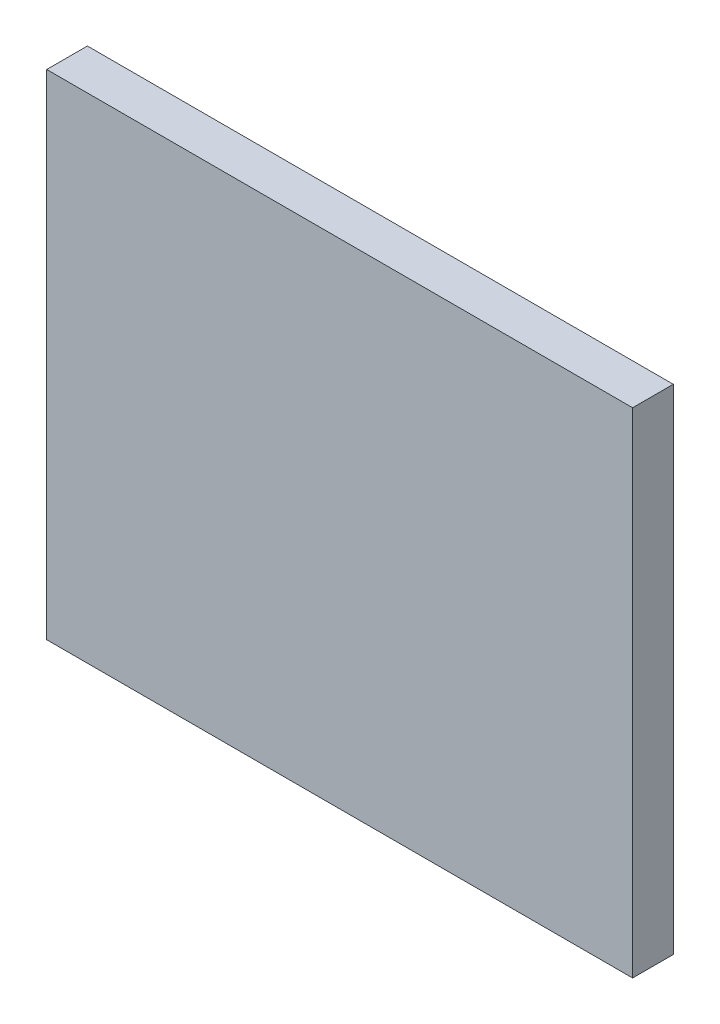
ISO-10303-21;
HEADER;
FILE_DESCRIPTION(('STEP AP214'),'2;1');
FILE_NAME('part.step','',(''),(''),'','','');
FILE_SCHEMA(('AUTOMOTIVE_DESIGN { 1 0 10303 214 1 1 1 1 }'));
ENDSEC;
DATA;
#1=APPLICATION_CONTEXT('core data for automotive mechanical design processes');
#2=APPLICATION_PROTOCOL_DEFINITION('international standard','automotive_design',2000,#1);
#3=PRODUCT_CONTEXT('',#1,'mechanical');
#4=PRODUCT('Part','Part','',(#3));
#5=PRODUCT_RELATED_PRODUCT_CATEGORY('part','',(#4));
#6=PRODUCT_DEFINITION_FORMATION('','',#4);
#7=PRODUCT_DEFINITION_CONTEXT('part definition',#1,'design');
#8=PRODUCT_DEFINITION('design','',#6,#7);
#9=PRODUCT_DEFINITION_SHAPE('','',#8);
#10=(LENGTH_UNIT() NAMED_UNIT(*) SI_UNIT(.MILLI.,.METRE.));
#11=(NAMED_UNIT(*) PLANE_ANGLE_UNIT() SI_UNIT($,.RADIAN.));
#12=(NAMED_UNIT(*) SI_UNIT($,.STERADIAN.) SOLID_ANGLE_UNIT());
#13=UNCERTAINTY_MEASURE_WITH_UNIT(LENGTH_MEASURE(1.E-05),#10,'distance_accuracy_value','');
#14=(GEOMETRIC_REPRESENTATION_CONTEXT(3) GLOBAL_UNCERTAINTY_ASSIGNED_CONTEXT((#13)) GLOBAL_UNIT_ASSIGNED_CONTEXT((#10,
#11,#12)) REPRESENTATION_CONTEXT('',''));
#15=CARTESIAN_POINT('',(0.,0.,0.));
#16=DIRECTION('',(0.,0.,1.));
#17=DIRECTION('',(1.,0.,0.));
#18=AXIS2_PLACEMENT_3D('',#15,#16,#17);
#19=CARTESIAN_POINT('',(24.511,14.224,3.));
#20=DIRECTION('',(0.,0.,-1.));
#21=DIRECTION('',(-1.,0.,0.));
#22=AXIS2_PLACEMENT_3D('',#19,#20,#21);
#23=PLANE('',#22);
#24=DIRECTION('',(0.,1.,0.));
#25=VECTOR('',#24,1.);
#26=CARTESIAN_POINT('',(-15.113,14.224,3.));
#27=LINE('',#26,#25);
#28=CARTESIAN_POINT('',(-15.113,14.224,3.));
#29=VERTEX_POINT('',#28);
#30=CARTESIAN_POINT('',(-15.113,-19.177,3.));
#31=VERTEX_POINT('',#30);
#32=EDGE_CURVE('E55',#29,#31,#27,.F.);
#33=ORIENTED_EDGE('',*,*,#32,.T.);
#34=DIRECTION('',(1.,0.,0.));
#35=VECTOR('',#34,1.);
#36=CARTESIAN_POINT('',(-15.113,-19.177,3.));
#37=LINE('',#36,#35);
#38=CARTESIAN_POINT('',(24.511,-19.177,3.));
#39=VERTEX_POINT('',#38);
#40=EDGE_CURVE('E57',#31,#39,#37,.T.);
#41=ORIENTED_EDGE('',*,*,#40,.T.);
#42=DIRECTION('',(0.,1.,0.));
#43=VECTOR('',#42,1.);
#44=CARTESIAN_POINT('',(24.511,-19.177,3.));
#45=LINE('',#44,#43);
#46=CARTESIAN_POINT('',(24.511,14.224,3.));
#47=VERTEX_POINT('',#46);
#48=EDGE_CURVE('E20',#39,#47,#45,.T.);
#49=ORIENTED_EDGE('',*,*,#48,.T.);
#50=DIRECTION('',(1.,0.,0.));
#51=VECTOR('',#50,1.);
#52=CARTESIAN_POINT('',(24.511,14.224,3.));
#53=LINE('',#52,#51);
#54=EDGE_CURVE('E80',#47,#29,#53,.F.);
#55=ORIENTED_EDGE('',*,*,#54,.T.);
#56=EDGE_LOOP('',(#33,#41,#49,#55));
#57=FACE_BOUND('',#56,.T.);
#58=ADVANCED_FACE('F17',(#57),#23,.F.);
#59=CARTESIAN_POINT('',(24.511,-19.177,0.25));
#60=DIRECTION('',(-1.,0.,0.));
#61=DIRECTION('',(0.,0.,1.));
#62=AXIS2_PLACEMENT_3D('',#59,#60,#61);
#63=PLANE('',#62);
#64=DIRECTION('',(0.,0.,-1.));
#65=VECTOR('',#64,1.);
#66=CARTESIAN_POINT('',(24.511,14.224,0.25));
#67=LINE('',#66,#65);
#68=CARTESIAN_POINT('',(24.511,14.224,0.25));
#69=VERTEX_POINT('',#68);
#70=EDGE_CURVE('E68',#69,#47,#67,.F.);
#71=ORIENTED_EDGE('',*,*,#70,.T.);
#72=ORIENTED_EDGE('',*,*,#48,.F.);
#73=DIRECTION('',(0.,0.,1.));
#74=VECTOR('',#73,1.);
#75=CARTESIAN_POINT('',(24.511,-19.177,0.25));
#76=LINE('',#75,#74);
#77=CARTESIAN_POINT('',(24.511,-19.177,0.25));
#78=VERTEX_POINT('',#77);
#79=EDGE_CURVE('E63',#39,#78,#76,.F.);
#80=ORIENTED_EDGE('',*,*,#79,.T.);
#81=DIRECTION('',(0.,1.,0.));
#82=VECTOR('',#81,1.);
#83=CARTESIAN_POINT('',(24.511,14.224,0.25));
#84=LINE('',#83,#82);
#85=EDGE_CURVE('E83',#69,#78,#84,.F.);
#86=ORIENTED_EDGE('',*,*,#85,.F.);
#87=EDGE_LOOP('',(#71,#72,#80,#86));
#88=FACE_BOUND('',#87,.T.);
#89=ADVANCED_FACE('F65',(#88),#63,.F.);
#90=CARTESIAN_POINT('',(-15.113,-19.177,0.25));
#91=DIRECTION('',(0.,1.,0.));
#92=DIRECTION('',(0.,0.,1.));
#93=AXIS2_PLACEMENT_3D('',#90,#91,#92);
#94=PLANE('',#93);
#95=ORIENTED_EDGE('',*,*,#79,.F.);
#96=ORIENTED_EDGE('',*,*,#40,.F.);
#97=DIRECTION('',(0.,0.,-1.));
#98=VECTOR('',#97,1.);
#99=CARTESIAN_POINT('',(-15.113,-19.177,0.25));
#100=LINE('',#99,#98);
#101=CARTESIAN_POINT('',(-15.113,-19.177,0.25));
#102=VERTEX_POINT('',#101);
#103=EDGE_CURVE('E75',#31,#102,#100,.T.);
#104=ORIENTED_EDGE('',*,*,#103,.T.);
#105=DIRECTION('',(-1.,0.,0.));
#106=VECTOR('',#105,1.);
#107=CARTESIAN_POINT('',(24.511,-19.177,0.25));
#108=LINE('',#107,#106);
#109=EDGE_CURVE('E72',#78,#102,#108,.T.);
#110=ORIENTED_EDGE('',*,*,#109,.F.);
#111=EDGE_LOOP('',(#95,#96,#104,#110));
#112=FACE_BOUND('',#111,.T.);
#113=ADVANCED_FACE('F70',(#112),#94,.F.);
#114=CARTESIAN_POINT('',(-15.113,14.224,0.25));
#115=DIRECTION('',(1.,0.,0.));
#116=DIRECTION('',(0.,0.,-1.));
#117=AXIS2_PLACEMENT_3D('',#114,#115,#116);
#118=PLANE('',#117);
#119=ORIENTED_EDGE('',*,*,#103,.F.);
#120=ORIENTED_EDGE('',*,*,#32,.F.);
#121=DIRECTION('',(0.,0.,-1.));
#122=VECTOR('',#121,1.);
#123=CARTESIAN_POINT('',(-15.113,14.224,0.25));
#124=LINE('',#123,#122);
#125=CARTESIAN_POINT('',(-15.113,14.224,0.25));
#126=VERTEX_POINT('',#125);
#127=EDGE_CURVE('E35',#29,#126,#124,.T.);
#128=ORIENTED_EDGE('',*,*,#127,.T.);
#129=DIRECTION('',(0.,1.,0.));
#130=VECTOR('',#129,1.);
#131=CARTESIAN_POINT('',(-15.113,14.224,0.25));
#132=LINE('',#131,#130);
#133=EDGE_CURVE('E26',#102,#126,#132,.T.);
#134=ORIENTED_EDGE('',*,*,#133,.F.);
#135=EDGE_LOOP('',(#119,#120,#128,#134));
#136=FACE_BOUND('',#135,.T.);
#137=ADVANCED_FACE('F89',(#136),#118,.F.);
#138=CARTESIAN_POINT('',(24.511,14.224,0.25));
#139=DIRECTION('',(0.,-1.,0.));
#140=DIRECTION('',(0.,0.,-1.));
#141=AXIS2_PLACEMENT_3D('',#138,#139,#140);
#142=PLANE('',#141);
#143=ORIENTED_EDGE('',*,*,#127,.F.);
#144=ORIENTED_EDGE('',*,*,#54,.F.);
#145=ORIENTED_EDGE('',*,*,#70,.F.);
#146=DIRECTION('',(-1.,0.,0.));
#147=VECTOR('',#146,1.);
#148=CARTESIAN_POINT('',(24.511,14.224,0.25));
#149=LINE('',#148,#147);
#150=EDGE_CURVE('E11',#126,#69,#149,.F.);
#151=ORIENTED_EDGE('',*,*,#150,.F.);
#152=EDGE_LOOP('',(#143,#144,#145,#151));
#153=FACE_BOUND('',#152,.T.);
#154=ADVANCED_FACE('F91',(#153),#142,.F.);
#155=CARTESIAN_POINT('',(24.511,14.224,0.25));
#156=DIRECTION('',(0.,0.,-1.));
#157=DIRECTION('',(-1.,0.,0.));
#158=AXIS2_PLACEMENT_3D('',#155,#156,#157);
#159=PLANE('',#158);
#160=ORIENTED_EDGE('',*,*,#133,.T.);
#161=ORIENTED_EDGE('',*,*,#150,.T.);
#162=ORIENTED_EDGE('',*,*,#85,.T.);
#163=ORIENTED_EDGE('',*,*,#109,.T.);
#164=EDGE_LOOP('',(#160,#161,#162,#163));
#165=FACE_BOUND('',#164,.T.);
#166=ADVANCED_FACE('F88',(#165),#159,.T.);
#167=CLOSED_SHELL('',(#58,#89,#113,#137,#154,#166));
#168=MANIFOLD_SOLID_BREP('B1',#167);
#169=ADVANCED_BREP_SHAPE_REPRESENTATION('',(#18,#168),#14);
#170=SHAPE_DEFINITION_REPRESENTATION(#9,#169);
ENDSEC;
END-ISO-10303-21;
